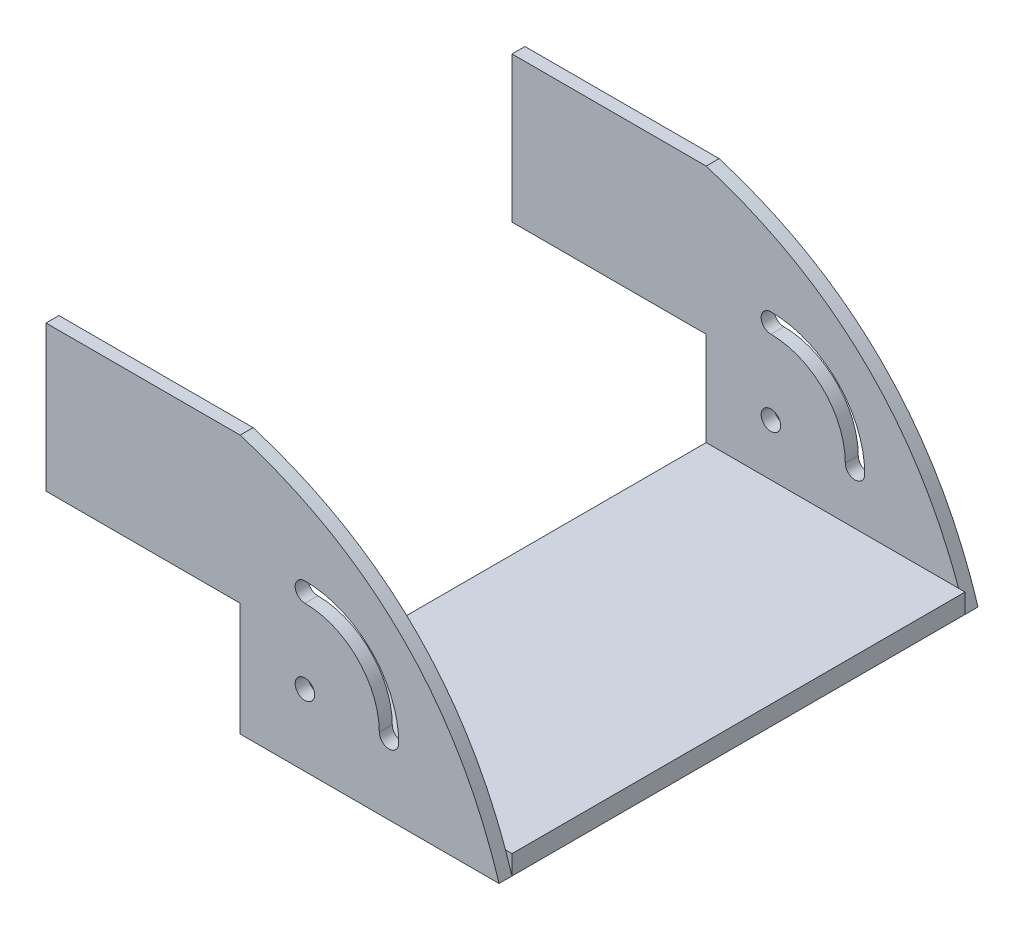
ISO-10303-21;
HEADER;
FILE_DESCRIPTION(('STEP AP214'),'2;1');
FILE_NAME('part.step','',(''),(''),'','','');
FILE_SCHEMA(('AUTOMOTIVE_DESIGN { 1 0 10303 214 1 1 1 1 }'));
ENDSEC;
DATA;
#1=APPLICATION_CONTEXT('core data for automotive mechanical design processes');
#2=APPLICATION_PROTOCOL_DEFINITION('international standard','automotive_design',2000,#1);
#3=PRODUCT_CONTEXT('',#1,'mechanical');
#4=PRODUCT('Part','Part','',(#3));
#5=PRODUCT_RELATED_PRODUCT_CATEGORY('part','',(#4));
#6=PRODUCT_DEFINITION_FORMATION('','',#4);
#7=PRODUCT_DEFINITION_CONTEXT('part definition',#1,'design');
#8=PRODUCT_DEFINITION('design','',#6,#7);
#9=PRODUCT_DEFINITION_SHAPE('','',#8);
#10=(LENGTH_UNIT() NAMED_UNIT(*) SI_UNIT(.MILLI.,.METRE.));
#11=(NAMED_UNIT(*) PLANE_ANGLE_UNIT() SI_UNIT($,.RADIAN.));
#12=(NAMED_UNIT(*) SI_UNIT($,.STERADIAN.) SOLID_ANGLE_UNIT());
#13=UNCERTAINTY_MEASURE_WITH_UNIT(LENGTH_MEASURE(1.E-05),#10,'distance_accuracy_value','');
#14=(GEOMETRIC_REPRESENTATION_CONTEXT(3) GLOBAL_UNCERTAINTY_ASSIGNED_CONTEXT((#13)) GLOBAL_UNIT_ASSIGNED_CONTEXT((#10,
#11,#12)) REPRESENTATION_CONTEXT('',''));
#15=CARTESIAN_POINT('',(0.,0.,0.));
#16=DIRECTION('',(0.,0.,1.));
#17=DIRECTION('',(1.,0.,0.));
#18=AXIS2_PLACEMENT_3D('',#15,#16,#17);
#19=CARTESIAN_POINT('',(0.,0.,0.));
#20=DIRECTION('',(0.,0.,1.));
#21=DIRECTION('',(1.,0.,0.));
#22=AXIS2_PLACEMENT_3D('',#19,#20,#21);
#23=PLANE('',#22);
#24=CARTESIAN_POINT('',(-29.0567596047048,30.7432432432432,0.));
#25=CARTESIAN_POINT('',(1.35924257163405,21.3531150689618,0.));
#26=CARTESIAN_POINT('',(10.9432403952952,-9.25675675675676,0.));
#27=B_SPLINE_CURVE_WITH_KNOTS('',2,(#24,#25,#26),.UNSPECIFIED.,.F.,.F.,(3,3),(0.,1.),.UNSPECIFIED.);
#28=CARTESIAN_POINT('',(9.93561448481804,-6.25675675675675,0.));
#29=VERTEX_POINT('',#28);
#30=CARTESIAN_POINT('',(10.9432403952952,-9.25675675675675,0.));
#31=VERTEX_POINT('',#30);
#32=EDGE_CURVE('E11',#29,#31,#27,.T.);
#33=ORIENTED_EDGE('',*,*,#32,.F.);
#34=DIRECTION('',(-1.,0.,0.));
#35=VECTOR('',#34,1.);
#36=CARTESIAN_POINT('',(10.9432403952952,-6.25675675675675,0.));
#37=LINE('',#36,#35);
#38=CARTESIAN_POINT('',(10.9432403952952,-6.25675675675675,0.));
#39=VERTEX_POINT('',#38);
#40=EDGE_CURVE('E83',#39,#29,#37,.T.);
#41=ORIENTED_EDGE('',*,*,#40,.F.);
#42=DIRECTION('',(0.,1.,0.));
#43=VECTOR('',#42,1.);
#44=CARTESIAN_POINT('',(10.9432403952952,-9.25675675675675,0.));
#45=LINE('',#44,#43);
#46=EDGE_CURVE('E74',#31,#39,#45,.T.);
#47=ORIENTED_EDGE('',*,*,#46,.F.);
#48=EDGE_LOOP('',(#33,#41,#47));
#49=FACE_BOUND('',#48,.T.);
#50=ADVANCED_FACE('F35',(#49),#23,.F.);
#51=CARTESIAN_POINT('',(0.,0.,70.));
#52=DIRECTION('',(0.,0.,1.));
#53=DIRECTION('',(1.,0.,0.));
#54=AXIS2_PLACEMENT_3D('',#51,#52,#53);
#55=PLANE('',#54);
#56=DIRECTION('',(-1.,0.,0.));
#57=VECTOR('',#56,1.);
#58=CARTESIAN_POINT('',(10.9432403952952,-6.25675675675675,70.));
#59=LINE('',#58,#57);
#60=CARTESIAN_POINT('',(10.9432403952952,-6.25675675675675,70.));
#61=VERTEX_POINT('',#60);
#62=CARTESIAN_POINT('',(9.93561448481804,-6.25675676647221,70.));
#63=VERTEX_POINT('',#62);
#64=EDGE_CURVE('E88',#61,#63,#59,.T.);
#65=ORIENTED_EDGE('',*,*,#64,.T.);
#66=CARTESIAN_POINT('',(-29.0567596047048,30.7432432432432,70.));
#67=CARTESIAN_POINT('',(1.35924257163405,21.3531150689618,70.));
#68=CARTESIAN_POINT('',(10.9432403952952,-9.25675675675676,70.));
#69=B_SPLINE_CURVE_WITH_KNOTS('',2,(#66,#67,#68),.UNSPECIFIED.,.F.,.F.,(3,3),(0.,1.),.UNSPECIFIED.);
#70=CARTESIAN_POINT('',(10.9432403952952,-9.25675675675675,70.));
#71=VERTEX_POINT('',#70);
#72=EDGE_CURVE('E45',#63,#71,#69,.T.);
#73=ORIENTED_EDGE('',*,*,#72,.T.);
#74=DIRECTION('',(0.,1.,0.));
#75=VECTOR('',#74,1.);
#76=CARTESIAN_POINT('',(10.9432403952952,-9.25675675675675,70.));
#77=LINE('',#76,#75);
#78=EDGE_CURVE('E61',#71,#61,#77,.T.);
#79=ORIENTED_EDGE('',*,*,#78,.T.);
#80=EDGE_LOOP('',(#65,#73,#79));
#81=FACE_BOUND('',#80,.T.);
#82=ADVANCED_FACE('F363',(#81),#55,.T.);
#83=CARTESIAN_POINT('',(10.9432403952952,-6.25675675675675,70.));
#84=DIRECTION('',(0.,-1.,0.));
#85=DIRECTION('',(1.,0.,0.));
#86=AXIS2_PLACEMENT_3D('',#83,#84,#85);
#87=PLANE('',#86);
#88=ORIENTED_EDGE('',*,*,#40,.T.);
#89=CARTESIAN_POINT('',(-29.0567596047048,-6.25675675675675,0.));
#90=VERTEX_POINT('',#89);
#91=EDGE_CURVE('E39',#29,#90,#37,.T.);
#92=ORIENTED_EDGE('',*,*,#91,.T.);
#93=DIRECTION('',(0.,0.,-1.));
#94=VECTOR('',#93,1.);
#95=CARTESIAN_POINT('',(-29.0567596047048,-6.25675675675675,70.));
#96=LINE('',#95,#94);
#97=CARTESIAN_POINT('',(-29.0567596047048,-6.25675675675675,70.));
#98=VERTEX_POINT('',#97);
#99=EDGE_CURVE('E99',#98,#90,#96,.T.);
#100=ORIENTED_EDGE('',*,*,#99,.F.);
#101=EDGE_CURVE('E82',#63,#98,#59,.T.);
#102=ORIENTED_EDGE('',*,*,#101,.F.);
#103=ORIENTED_EDGE('',*,*,#64,.F.);
#104=DIRECTION('',(0.,0.,-1.));
#105=VECTOR('',#104,1.);
#106=CARTESIAN_POINT('',(10.9432403952952,-6.25675675675675,70.));
#107=LINE('',#106,#105);
#108=EDGE_CURVE('E77',#61,#39,#107,.T.);
#109=ORIENTED_EDGE('',*,*,#108,.T.);
#110=EDGE_LOOP('',(#88,#92,#100,#102,#103,#109));
#111=FACE_BOUND('',#110,.T.);
#112=ADVANCED_FACE('F37',(#111),#87,.F.);
#113=CARTESIAN_POINT('',(-29.0567596047048,-6.25675675675675,70.));
#114=DIRECTION('',(1.,0.,0.));
#115=DIRECTION('',(0.,1.,0.));
#116=AXIS2_PLACEMENT_3D('',#113,#114,#115);
#117=PLANE('',#116);
#118=ORIENTED_EDGE('',*,*,#99,.T.);
#119=DIRECTION('',(0.,-1.,0.));
#120=VECTOR('',#119,1.);
#121=CARTESIAN_POINT('',(-29.0567596047048,0.,0.));
#122=LINE('',#121,#120);
#123=CARTESIAN_POINT('',(-29.0567596047048,8.24324324324324,0.));
#124=VERTEX_POINT('',#123);
#125=EDGE_CURVE('E229',#124,#90,#122,.T.);
#126=ORIENTED_EDGE('',*,*,#125,.F.);
#127=DIRECTION('',(0.,0.,-1.));
#128=VECTOR('',#127,1.);
#129=CARTESIAN_POINT('',(-29.0567596047048,8.24324324324324,0.));
#130=LINE('',#129,#128);
#131=CARTESIAN_POINT('',(-29.0567596047048,8.24324324324324,-1.99999999999999));
#132=VERTEX_POINT('',#131);
#133=EDGE_CURVE('E225',#124,#132,#130,.T.);
#134=ORIENTED_EDGE('',*,*,#133,.T.);
#135=DIRECTION('',(0.,-1.,0.));
#136=VECTOR('',#135,1.);
#137=CARTESIAN_POINT('',(-29.0567596047048,0.,-1.99999999999999));
#138=LINE('',#137,#136);
#139=CARTESIAN_POINT('',(-29.0567596047048,-9.25675675675675,-1.99999999999999));
#140=VERTEX_POINT('',#139);
#141=EDGE_CURVE('E745',#132,#140,#138,.T.);
#142=ORIENTED_EDGE('',*,*,#141,.T.);
#143=DIRECTION('',(0.,0.,-1.));
#144=VECTOR('',#143,1.);
#145=CARTESIAN_POINT('',(-29.0567596047048,-9.25675675675675,70.));
#146=LINE('',#145,#144);
#147=CARTESIAN_POINT('',(-29.0567596047048,-9.25675675675675,72.));
#148=VERTEX_POINT('',#147);
#149=EDGE_CURVE('E96',#148,#140,#146,.T.);
#150=ORIENTED_EDGE('',*,*,#149,.F.);
#151=DIRECTION('',(0.,-1.,0.));
#152=VECTOR('',#151,1.);
#153=CARTESIAN_POINT('',(-29.0567596047048,0.,72.));
#154=LINE('',#153,#152);
#155=CARTESIAN_POINT('',(-29.0567596047048,8.24324324324324,72.));
#156=VERTEX_POINT('',#155);
#157=EDGE_CURVE('E182',#156,#148,#154,.T.);
#158=ORIENTED_EDGE('',*,*,#157,.F.);
#159=DIRECTION('',(0.,0.,-1.));
#160=VECTOR('',#159,1.);
#161=CARTESIAN_POINT('',(-29.0567596047048,8.24324324324324,72.));
#162=LINE('',#161,#160);
#163=CARTESIAN_POINT('',(-29.0567596047048,8.24324324324324,70.));
#164=VERTEX_POINT('',#163);
#165=EDGE_CURVE('E110',#156,#164,#162,.T.);
#166=ORIENTED_EDGE('',*,*,#165,.T.);
#167=DIRECTION('',(0.,-1.,0.));
#168=VECTOR('',#167,1.);
#169=CARTESIAN_POINT('',(-29.0567596047048,0.,70.));
#170=LINE('',#169,#168);
#171=EDGE_CURVE('E104',#164,#98,#170,.T.);
#172=ORIENTED_EDGE('',*,*,#171,.T.);
#173=EDGE_LOOP('',(#118,#126,#134,#142,#150,#158,#166,#172));
#174=FACE_BOUND('',#173,.T.);
#175=ADVANCED_FACE('F177',(#174),#117,.F.);
#176=CARTESIAN_POINT('',(-29.0567596047048,-9.25675675675675,70.));
#177=DIRECTION('',(0.,1.,0.));
#178=DIRECTION('',(0.,0.,1.));
#179=AXIS2_PLACEMENT_3D('',#176,#177,#178);
#180=PLANE('',#179);
#181=ORIENTED_EDGE('',*,*,#149,.T.);
#182=DIRECTION('',(1.,0.,0.));
#183=VECTOR('',#182,1.);
#184=CARTESIAN_POINT('',(0.,-9.25675675675675,-1.99999999999999));
#185=LINE('',#184,#183);
#186=CARTESIAN_POINT('',(10.9432403952952,-9.25675675675675,-1.99999999999999));
#187=VERTEX_POINT('',#186);
#188=EDGE_CURVE('E712',#140,#187,#185,.T.);
#189=ORIENTED_EDGE('',*,*,#188,.T.);
#190=DIRECTION('',(0.,0.,-1.));
#191=VECTOR('',#190,1.);
#192=CARTESIAN_POINT('',(10.9432403952952,-9.25675675675675,0.));
#193=LINE('',#192,#191);
#194=EDGE_CURVE('E222',#31,#187,#193,.T.);
#195=ORIENTED_EDGE('',*,*,#194,.F.);
#196=DIRECTION('',(0.,0.,-1.));
#197=VECTOR('',#196,1.);
#198=CARTESIAN_POINT('',(10.9432403952952,-9.25675675675675,70.));
#199=LINE('',#198,#197);
#200=EDGE_CURVE('E81',#71,#31,#199,.T.);
#201=ORIENTED_EDGE('',*,*,#200,.F.);
#202=DIRECTION('',(0.,0.,-1.));
#203=VECTOR('',#202,1.);
#204=CARTESIAN_POINT('',(10.9432403952952,-9.25675675675675,72.));
#205=LINE('',#204,#203);
#206=CARTESIAN_POINT('',(10.9432403952952,-9.25675675675675,72.));
#207=VERTEX_POINT('',#206);
#208=EDGE_CURVE('E165',#207,#71,#205,.T.);
#209=ORIENTED_EDGE('',*,*,#208,.F.);
#210=DIRECTION('',(1.,0.,0.));
#211=VECTOR('',#210,1.);
#212=CARTESIAN_POINT('',(0.,-9.25675675675675,72.));
#213=LINE('',#212,#211);
#214=EDGE_CURVE('E308',#148,#207,#213,.T.);
#215=ORIENTED_EDGE('',*,*,#214,.F.);
#216=EDGE_LOOP('',(#181,#189,#195,#201,#209,#215));
#217=FACE_BOUND('',#216,.T.);
#218=ADVANCED_FACE('F373',(#217),#180,.F.);
#219=CARTESIAN_POINT('',(10.9432403952952,-9.25675675675675,70.));
#220=DIRECTION('',(-1.,0.,0.));
#221=DIRECTION('',(0.,0.,1.));
#222=AXIS2_PLACEMENT_3D('',#219,#220,#221);
#223=PLANE('',#222);
#224=ORIENTED_EDGE('',*,*,#46,.T.);
#225=ORIENTED_EDGE('',*,*,#108,.F.);
#226=ORIENTED_EDGE('',*,*,#78,.F.);
#227=ORIENTED_EDGE('',*,*,#200,.T.);
#228=EDGE_LOOP('',(#224,#225,#226,#227));
#229=FACE_BOUND('',#228,.T.);
#230=ADVANCED_FACE('F76',(#229),#223,.F.);
#231=CARTESIAN_POINT('',(0.,0.,70.));
#232=DIRECTION('',(0.,0.,1.));
#233=DIRECTION('',(1.,0.,0.));
#234=AXIS2_PLACEMENT_3D('',#231,#232,#233);
#235=PLANE('',#234);
#236=CARTESIAN_POINT('',(-19.0567596047048,1.74324324324325,70.));
#237=DIRECTION('',(0.,0.,1.));
#238=DIRECTION('',(1.,0.,0.));
#239=AXIS2_PLACEMENT_3D('',#236,#237,#238);
#240=CIRCLE('',#239,1.5);
#241=CARTESIAN_POINT('',(-17.5567596047048,1.74324324324325,70.));
#242=VERTEX_POINT('',#241);
#243=EDGE_CURVE('E129',#242,#242,#240,.T.);
#244=ORIENTED_EDGE('',*,*,#243,.T.);
#245=EDGE_LOOP('',(#244));
#246=FACE_BOUND('',#245,.T.);
#247=CARTESIAN_POINT('',(-19.0567596047048,14.7432432432432,70.));
#248=DIRECTION('',(0.,0.,1.));
#249=DIRECTION('',(1.,0.,0.));
#250=AXIS2_PLACEMENT_3D('',#247,#248,#249);
#251=CIRCLE('',#250,1.5);
#252=CARTESIAN_POINT('',(-19.0567596047048,16.2432432432432,70.));
#253=VERTEX_POINT('',#252);
#254=CARTESIAN_POINT('',(-19.0567596047048,13.2432432432432,70.));
#255=VERTEX_POINT('',#254);
#256=EDGE_CURVE('E132',#253,#255,#251,.T.);
#257=ORIENTED_EDGE('',*,*,#256,.T.);
#258=CARTESIAN_POINT('',(-19.0567596047048,1.74324324324325,70.));
#259=DIRECTION('',(0.,0.,1.));
#260=DIRECTION('',(1.,0.,0.));
#261=AXIS2_PLACEMENT_3D('',#258,#259,#260);
#262=CIRCLE('',#261,11.5);
#263=CARTESIAN_POINT('',(-7.55675960470479,1.74324324324325,70.));
#264=VERTEX_POINT('',#263);
#265=EDGE_CURVE('E141',#264,#255,#262,.T.);
#266=ORIENTED_EDGE('',*,*,#265,.F.);
#267=CARTESIAN_POINT('',(-6.05675960470479,1.74324324324325,70.));
#268=DIRECTION('',(0.,0.,1.));
#269=DIRECTION('',(1.,0.,0.));
#270=AXIS2_PLACEMENT_3D('',#267,#268,#269);
#271=CIRCLE('',#270,1.5);
#272=CARTESIAN_POINT('',(-4.55675960470479,1.74324324324325,70.));
#273=VERTEX_POINT('',#272);
#274=EDGE_CURVE('E138',#264,#273,#271,.T.);
#275=ORIENTED_EDGE('',*,*,#274,.T.);
#276=CARTESIAN_POINT('',(-19.0567596047048,1.74324324324325,70.));
#277=DIRECTION('',(0.,0.,1.));
#278=DIRECTION('',(1.,0.,0.));
#279=AXIS2_PLACEMENT_3D('',#276,#277,#278);
#280=CIRCLE('',#279,14.5);
#281=EDGE_CURVE('E135',#273,#253,#280,.T.);
#282=ORIENTED_EDGE('',*,*,#281,.T.);
#283=EDGE_LOOP('',(#257,#266,#275,#282));
#284=FACE_BOUND('',#283,.T.);
#285=CARTESIAN_POINT('',(-29.0567596047048,30.7432432432432,70.));
#286=VERTEX_POINT('',#285);
#287=EDGE_CURVE('E108',#286,#63,#69,.T.);
#288=ORIENTED_EDGE('',*,*,#287,.T.);
#289=ORIENTED_EDGE('',*,*,#101,.T.);
#290=ORIENTED_EDGE('',*,*,#171,.F.);
#291=DIRECTION('',(-1.,0.,0.));
#292=VECTOR('',#291,1.);
#293=CARTESIAN_POINT('',(0.,8.24324324324325,70.));
#294=LINE('',#293,#292);
#295=CARTESIAN_POINT('',(-59.0567596047048,8.24324324324324,70.));
#296=VERTEX_POINT('',#295);
#297=EDGE_CURVE('E109',#164,#296,#294,.T.);
#298=ORIENTED_EDGE('',*,*,#297,.T.);
#299=DIRECTION('',(0.,-1.,0.));
#300=VECTOR('',#299,1.);
#301=CARTESIAN_POINT('',(-59.0567596047048,0.,70.));
#302=LINE('',#301,#300);
#303=CARTESIAN_POINT('',(-59.0567596047048,30.7432432432432,70.));
#304=VERTEX_POINT('',#303);
#305=EDGE_CURVE('E126',#304,#296,#302,.T.);
#306=ORIENTED_EDGE('',*,*,#305,.F.);
#307=DIRECTION('',(-1.,0.,0.));
#308=VECTOR('',#307,1.);
#309=CARTESIAN_POINT('',(0.,30.7432432432433,70.));
#310=LINE('',#309,#308);
#311=EDGE_CURVE('E120',#286,#304,#310,.T.);
#312=ORIENTED_EDGE('',*,*,#311,.F.);
#313=EDGE_LOOP('',(#288,#289,#290,#298,#306,#312));
#314=FACE_BOUND('',#313,.T.);
#315=ADVANCED_FACE('F192',(#246,#284,#314),#235,.F.);
#316=CARTESIAN_POINT('',(-19.0567596047048,14.7432432432432,72.));
#317=DIRECTION('',(0.,0.,-1.));
#318=DIRECTION('',(-1.,0.,0.));
#319=AXIS2_PLACEMENT_3D('',#316,#317,#318);
#320=CYLINDRICAL_SURFACE('',#319,1.5);
#321=ORIENTED_EDGE('',*,*,#256,.F.);
#322=DIRECTION('',(0.,0.,-1.));
#323=VECTOR('',#322,1.);
#324=CARTESIAN_POINT('',(-19.0567596047048,16.2432432432432,72.));
#325=LINE('',#324,#323);
#326=CARTESIAN_POINT('',(-19.0567596047048,16.2432432432432,72.));
#327=VERTEX_POINT('',#326);
#328=EDGE_CURVE('E90',#327,#253,#325,.T.);
#329=ORIENTED_EDGE('',*,*,#328,.F.);
#330=CARTESIAN_POINT('',(-19.0567596047048,14.7432432432432,72.));
#331=DIRECTION('',(0.,0.,1.));
#332=DIRECTION('',(1.,0.,0.));
#333=AXIS2_PLACEMENT_3D('',#330,#331,#332);
#334=CIRCLE('',#333,1.5);
#335=CARTESIAN_POINT('',(-19.0567596047048,13.2432432432432,72.));
#336=VERTEX_POINT('',#335);
#337=EDGE_CURVE('E320',#327,#336,#334,.T.);
#338=ORIENTED_EDGE('',*,*,#337,.T.);
#339=DIRECTION('',(0.,0.,-1.));
#340=VECTOR('',#339,1.);
#341=CARTESIAN_POINT('',(-19.0567596047048,13.2432432432432,72.));
#342=LINE('',#341,#340);
#343=EDGE_CURVE('E145',#336,#255,#342,.T.);
#344=ORIENTED_EDGE('',*,*,#343,.T.);
#345=EDGE_LOOP('',(#321,#329,#338,#344));
#346=FACE_BOUND('',#345,.T.);
#347=ADVANCED_FACE('F268',(#346),#320,.F.);
#348=CARTESIAN_POINT('',(-19.0567596047048,1.74324324324325,72.));
#349=DIRECTION('',(0.,0.,-1.));
#350=DIRECTION('',(-1.,0.,0.));
#351=AXIS2_PLACEMENT_3D('',#348,#349,#350);
#352=CYLINDRICAL_SURFACE('',#351,14.5);
#353=ORIENTED_EDGE('',*,*,#281,.F.);
#354=DIRECTION('',(0.,0.,-1.));
#355=VECTOR('',#354,1.);
#356=CARTESIAN_POINT('',(-4.55675960470479,1.74324324324325,72.));
#357=LINE('',#356,#355);
#358=CARTESIAN_POINT('',(-4.55675960470479,1.74324324324325,72.));
#359=VERTEX_POINT('',#358);
#360=EDGE_CURVE('E151',#359,#273,#357,.T.);
#361=ORIENTED_EDGE('',*,*,#360,.F.);
#362=CARTESIAN_POINT('',(-19.0567596047048,1.74324324324325,72.));
#363=DIRECTION('',(0.,0.,1.));
#364=DIRECTION('',(1.,0.,0.));
#365=AXIS2_PLACEMENT_3D('',#362,#363,#364);
#366=CIRCLE('',#365,14.5);
#367=EDGE_CURVE('E323',#359,#327,#366,.T.);
#368=ORIENTED_EDGE('',*,*,#367,.T.);
#369=ORIENTED_EDGE('',*,*,#328,.T.);
#370=EDGE_LOOP('',(#353,#361,#368,#369));
#371=FACE_BOUND('',#370,.T.);
#372=ADVANCED_FACE('F277',(#371),#352,.F.);
#373=CARTESIAN_POINT('',(-6.05675960470479,1.74324324324325,72.));
#374=DIRECTION('',(0.,0.,-1.));
#375=DIRECTION('',(-1.,0.,0.));
#376=AXIS2_PLACEMENT_3D('',#373,#374,#375);
#377=CYLINDRICAL_SURFACE('',#376,1.5);
#378=ORIENTED_EDGE('',*,*,#274,.F.);
#379=DIRECTION('',(0.,0.,-1.));
#380=VECTOR('',#379,1.);
#381=CARTESIAN_POINT('',(-7.55675960470479,1.74324324324325,72.));
#382=LINE('',#381,#380);
#383=CARTESIAN_POINT('',(-7.55675960470479,1.74324324324325,72.));
#384=VERTEX_POINT('',#383);
#385=EDGE_CURVE('E148',#384,#264,#382,.T.);
#386=ORIENTED_EDGE('',*,*,#385,.F.);
#387=CARTESIAN_POINT('',(-6.05675960470479,1.74324324324325,72.));
#388=DIRECTION('',(0.,0.,1.));
#389=DIRECTION('',(1.,0.,0.));
#390=AXIS2_PLACEMENT_3D('',#387,#388,#389);
#391=CIRCLE('',#390,1.5);
#392=EDGE_CURVE('E326',#384,#359,#391,.T.);
#393=ORIENTED_EDGE('',*,*,#392,.T.);
#394=ORIENTED_EDGE('',*,*,#360,.T.);
#395=EDGE_LOOP('',(#378,#386,#393,#394));
#396=FACE_BOUND('',#395,.T.);
#397=ADVANCED_FACE('F274',(#396),#377,.F.);
#398=CARTESIAN_POINT('',(0.,8.24324324324325,72.));
#399=DIRECTION('',(0.,-1.,0.));
#400=DIRECTION('',(1.,0.,0.));
#401=AXIS2_PLACEMENT_3D('',#398,#399,#400);
#402=PLANE('',#401);
#403=ORIENTED_EDGE('',*,*,#297,.F.);
#404=ORIENTED_EDGE('',*,*,#165,.F.);
#405=DIRECTION('',(-1.,0.,0.));
#406=VECTOR('',#405,1.);
#407=CARTESIAN_POINT('',(0.,8.24324324324325,72.));
#408=LINE('',#407,#406);
#409=CARTESIAN_POINT('',(-59.0567596047048,8.24324324324324,72.));
#410=VERTEX_POINT('',#409);
#411=EDGE_CURVE('E144',#156,#410,#408,.T.);
#412=ORIENTED_EDGE('',*,*,#411,.T.);
#413=DIRECTION('',(0.,0.,-1.));
#414=VECTOR('',#413,1.);
#415=CARTESIAN_POINT('',(-59.0567596047048,8.24324324324324,72.));
#416=LINE('',#415,#414);
#417=EDGE_CURVE('E156',#410,#296,#416,.T.);
#418=ORIENTED_EDGE('',*,*,#417,.T.);
#419=EDGE_LOOP('',(#403,#404,#412,#418));
#420=FACE_BOUND('',#419,.T.);
#421=ADVANCED_FACE('F195',(#420),#402,.T.);
#422=CARTESIAN_POINT('',(-29.0567596047048,30.7432432432432,72.));
#423=CARTESIAN_POINT('',(1.35924257163405,21.3531150689618,72.));
#424=CARTESIAN_POINT('',(10.9432403952952,-9.25675675675676,72.));
#425=B_SPLINE_CURVE_WITH_KNOTS('',2,(#422,#423,#424),.UNSPECIFIED.,.F.,.F.,(3,3),(0.,1.),.UNSPECIFIED.);
#426=DIRECTION('',(0.,0.,-1.));
#427=VECTOR('',#426,1.);
#428=SURFACE_OF_LINEAR_EXTRUSION('',#425,#427);
#429=ORIENTED_EDGE('',*,*,#287,.F.);
#430=DIRECTION('',(0.,0.,-1.));
#431=VECTOR('',#430,1.);
#432=CARTESIAN_POINT('',(-29.0567596047048,30.7432432432432,72.));
#433=LINE('',#432,#431);
#434=CARTESIAN_POINT('',(-29.0567596047048,30.7432432432432,72.));
#435=VERTEX_POINT('',#434);
#436=EDGE_CURVE('E163',#435,#286,#433,.T.);
#437=ORIENTED_EDGE('',*,*,#436,.F.);
#438=EDGE_CURVE('E301',#435,#207,#425,.T.);
#439=ORIENTED_EDGE('',*,*,#438,.T.);
#440=ORIENTED_EDGE('',*,*,#208,.T.);
#441=ORIENTED_EDGE('',*,*,#72,.F.);
#442=EDGE_LOOP('',(#429,#437,#439,#440,#441));
#443=FACE_BOUND('',#442,.T.);
#444=ADVANCED_FACE('F295',(#443),#428,.T.);
#445=CARTESIAN_POINT('',(0.,30.7432432432433,72.));
#446=DIRECTION('',(0.,-1.,0.));
#447=DIRECTION('',(1.,0.,0.));
#448=AXIS2_PLACEMENT_3D('',#445,#446,#447);
#449=PLANE('',#448);
#450=ORIENTED_EDGE('',*,*,#311,.T.);
#451=DIRECTION('',(0.,0.,-1.));
#452=VECTOR('',#451,1.);
#453=CARTESIAN_POINT('',(-59.0567596047048,30.7432432432432,72.));
#454=LINE('',#453,#452);
#455=CARTESIAN_POINT('',(-59.0567596047048,30.7432432432432,72.));
#456=VERTEX_POINT('',#455);
#457=EDGE_CURVE('E159',#456,#304,#454,.T.);
#458=ORIENTED_EDGE('',*,*,#457,.F.);
#459=DIRECTION('',(-1.,0.,0.));
#460=VECTOR('',#459,1.);
#461=CARTESIAN_POINT('',(0.,30.7432432432433,72.));
#462=LINE('',#461,#460);
#463=EDGE_CURVE('E307',#435,#456,#462,.T.);
#464=ORIENTED_EDGE('',*,*,#463,.F.);
#465=ORIENTED_EDGE('',*,*,#436,.T.);
#466=EDGE_LOOP('',(#450,#458,#464,#465));
#467=FACE_BOUND('',#466,.T.);
#468=ADVANCED_FACE('F288',(#467),#449,.F.);
#469=CARTESIAN_POINT('',(-19.0567596047048,1.74324324324325,72.));
#470=DIRECTION('',(0.,0.,-1.));
#471=DIRECTION('',(-1.,0.,0.));
#472=AXIS2_PLACEMENT_3D('',#469,#470,#471);
#473=CYLINDRICAL_SURFACE('',#472,1.5);
#474=CARTESIAN_POINT('',(-19.0567596047048,1.74324324324325,72.));
#475=DIRECTION('',(0.,0.,1.));
#476=DIRECTION('',(1.,0.,0.));
#477=AXIS2_PLACEMENT_3D('',#474,#475,#476);
#478=CIRCLE('',#477,1.5);
#479=CARTESIAN_POINT('',(-17.5567596047048,1.74324324324325,72.));
#480=VERTEX_POINT('',#479);
#481=EDGE_CURVE('E317',#480,#480,#478,.T.);
#482=ORIENTED_EDGE('',*,*,#481,.T.);
#483=EDGE_LOOP('',(#482));
#484=FACE_BOUND('',#483,.T.);
#485=ORIENTED_EDGE('',*,*,#243,.F.);
#486=EDGE_LOOP('',(#485));
#487=FACE_BOUND('',#486,.T.);
#488=ADVANCED_FACE('F285',(#484,#487),#473,.F.);
#489=CARTESIAN_POINT('',(-59.0567596047048,0.,72.));
#490=DIRECTION('',(1.,0.,0.));
#491=DIRECTION('',(0.,1.,0.));
#492=AXIS2_PLACEMENT_3D('',#489,#490,#491);
#493=PLANE('',#492);
#494=ORIENTED_EDGE('',*,*,#305,.T.);
#495=ORIENTED_EDGE('',*,*,#417,.F.);
#496=DIRECTION('',(0.,-1.,0.));
#497=VECTOR('',#496,1.);
#498=CARTESIAN_POINT('',(-59.0567596047048,0.,72.));
#499=LINE('',#498,#497);
#500=EDGE_CURVE('E314',#456,#410,#499,.T.);
#501=ORIENTED_EDGE('',*,*,#500,.F.);
#502=ORIENTED_EDGE('',*,*,#457,.T.);
#503=EDGE_LOOP('',(#494,#495,#501,#502));
#504=FACE_BOUND('',#503,.T.);
#505=ADVANCED_FACE('F272',(#504),#493,.F.);
#506=CARTESIAN_POINT('',(-19.0567596047048,1.74324324324325,72.));
#507=DIRECTION('',(0.,0.,-1.));
#508=DIRECTION('',(-1.,0.,0.));
#509=AXIS2_PLACEMENT_3D('',#506,#507,#508);
#510=CYLINDRICAL_SURFACE('',#509,11.5);
#511=ORIENTED_EDGE('',*,*,#265,.T.);
#512=ORIENTED_EDGE('',*,*,#343,.F.);
#513=CARTESIAN_POINT('',(-19.0567596047048,1.74324324324325,72.));
#514=DIRECTION('',(0.,0.,1.));
#515=DIRECTION('',(1.,0.,0.));
#516=AXIS2_PLACEMENT_3D('',#513,#514,#515);
#517=CIRCLE('',#516,11.5);
#518=EDGE_CURVE('E160',#384,#336,#517,.T.);
#519=ORIENTED_EDGE('',*,*,#518,.F.);
#520=ORIENTED_EDGE('',*,*,#385,.T.);
#521=EDGE_LOOP('',(#511,#512,#519,#520));
#522=FACE_BOUND('',#521,.T.);
#523=ADVANCED_FACE('F264',(#522),#510,.T.);
#524=CARTESIAN_POINT('',(0.,0.,72.));
#525=DIRECTION('',(0.,0.,1.));
#526=DIRECTION('',(1.,0.,0.));
#527=AXIS2_PLACEMENT_3D('',#524,#525,#526);
#528=PLANE('',#527);
#529=ORIENTED_EDGE('',*,*,#411,.F.);
#530=ORIENTED_EDGE('',*,*,#157,.T.);
#531=ORIENTED_EDGE('',*,*,#214,.T.);
#532=ORIENTED_EDGE('',*,*,#438,.F.);
#533=ORIENTED_EDGE('',*,*,#463,.T.);
#534=ORIENTED_EDGE('',*,*,#500,.T.);
#535=EDGE_LOOP('',(#529,#530,#531,#532,#533,#534));
#536=FACE_BOUND('',#535,.T.);
#537=ORIENTED_EDGE('',*,*,#481,.F.);
#538=EDGE_LOOP('',(#537));
#539=FACE_BOUND('',#538,.T.);
#540=ORIENTED_EDGE('',*,*,#337,.F.);
#541=ORIENTED_EDGE('',*,*,#367,.F.);
#542=ORIENTED_EDGE('',*,*,#392,.F.);
#543=ORIENTED_EDGE('',*,*,#518,.T.);
#544=EDGE_LOOP('',(#540,#541,#542,#543));
#545=FACE_BOUND('',#544,.T.);
#546=ADVANCED_FACE('F260',(#536,#539,#545),#528,.T.);
#547=CARTESIAN_POINT('',(0.,0.,0.));
#548=DIRECTION('',(0.,0.,1.));
#549=DIRECTION('',(1.,0.,0.));
#550=AXIS2_PLACEMENT_3D('',#547,#548,#549);
#551=PLANE('',#550);
#552=CARTESIAN_POINT('',(-19.0567596047048,14.7432432432432,0.));
#553=DIRECTION('',(0.,0.,1.));
#554=DIRECTION('',(1.,0.,0.));
#555=AXIS2_PLACEMENT_3D('',#552,#553,#554);
#556=CIRCLE('',#555,1.5);
#557=CARTESIAN_POINT('',(-19.0567596047048,16.2432432432432,0.));
#558=VERTEX_POINT('',#557);
#559=CARTESIAN_POINT('',(-19.0567596047048,13.2432432432432,0.));
#560=VERTEX_POINT('',#559);
#561=EDGE_CURVE('E733',#558,#560,#556,.T.);
#562=ORIENTED_EDGE('',*,*,#561,.F.);
#563=CARTESIAN_POINT('',(-19.0567596047048,1.74324324324325,0.));
#564=DIRECTION('',(0.,0.,1.));
#565=DIRECTION('',(1.,0.,0.));
#566=AXIS2_PLACEMENT_3D('',#563,#564,#565);
#567=CIRCLE('',#566,14.5);
#568=CARTESIAN_POINT('',(-4.55675960470479,1.74324324324325,0.));
#569=VERTEX_POINT('',#568);
#570=EDGE_CURVE('E736',#569,#558,#567,.T.);
#571=ORIENTED_EDGE('',*,*,#570,.F.);
#572=CARTESIAN_POINT('',(-6.05675960470479,1.74324324324325,0.));
#573=DIRECTION('',(0.,0.,1.));
#574=DIRECTION('',(1.,0.,0.));
#575=AXIS2_PLACEMENT_3D('',#572,#573,#574);
#576=CIRCLE('',#575,1.5);
#577=CARTESIAN_POINT('',(-7.55675960470479,1.74324324324325,0.));
#578=VERTEX_POINT('',#577);
#579=EDGE_CURVE('E667',#578,#569,#576,.T.);
#580=ORIENTED_EDGE('',*,*,#579,.F.);
#581=CARTESIAN_POINT('',(-19.0567596047048,1.74324324324325,0.));
#582=DIRECTION('',(0.,0.,1.));
#583=DIRECTION('',(1.,0.,0.));
#584=AXIS2_PLACEMENT_3D('',#581,#582,#583);
#585=CIRCLE('',#584,11.5);
#586=EDGE_CURVE('E216',#578,#560,#585,.T.);
#587=ORIENTED_EDGE('',*,*,#586,.T.);
#588=EDGE_LOOP('',(#562,#571,#580,#587));
#589=FACE_BOUND('',#588,.T.);
#590=CARTESIAN_POINT('',(-19.0567596047048,1.74324324324325,0.));
#591=DIRECTION('',(0.,0.,1.));
#592=DIRECTION('',(1.,0.,0.));
#593=AXIS2_PLACEMENT_3D('',#590,#591,#592);
#594=CIRCLE('',#593,1.5);
#595=CARTESIAN_POINT('',(-17.5567596047048,1.74324324324325,0.));
#596=VERTEX_POINT('',#595);
#597=EDGE_CURVE('E737',#596,#596,#594,.T.);
#598=ORIENTED_EDGE('',*,*,#597,.F.);
#599=EDGE_LOOP('',(#598));
#600=FACE_BOUND('',#599,.T.);
#601=ORIENTED_EDGE('',*,*,#91,.F.);
#602=CARTESIAN_POINT('',(-29.0567596047048,30.7432432432432,0.));
#603=VERTEX_POINT('',#602);
#604=EDGE_CURVE('E47',#603,#29,#27,.T.);
#605=ORIENTED_EDGE('',*,*,#604,.F.);
#606=DIRECTION('',(-1.,0.,0.));
#607=VECTOR('',#606,1.);
#608=CARTESIAN_POINT('',(0.,30.7432432432433,0.));
#609=LINE('',#608,#607);
#610=CARTESIAN_POINT('',(-59.0567596047048,30.7432432432432,0.));
#611=VERTEX_POINT('',#610);
#612=EDGE_CURVE('E242',#603,#611,#609,.T.);
#613=ORIENTED_EDGE('',*,*,#612,.T.);
#614=DIRECTION('',(0.,-1.,0.));
#615=VECTOR('',#614,1.);
#616=CARTESIAN_POINT('',(-59.0567596047048,0.,0.));
#617=LINE('',#616,#615);
#618=CARTESIAN_POINT('',(-59.0567596047048,8.24324324324324,0.));
#619=VERTEX_POINT('',#618);
#620=EDGE_CURVE('E761',#611,#619,#617,.T.);
#621=ORIENTED_EDGE('',*,*,#620,.T.);
#622=DIRECTION('',(-1.,0.,0.));
#623=VECTOR('',#622,1.);
#624=CARTESIAN_POINT('',(0.,8.24324324324325,0.));
#625=LINE('',#624,#623);
#626=EDGE_CURVE('E233',#124,#619,#625,.T.);
#627=ORIENTED_EDGE('',*,*,#626,.F.);
#628=ORIENTED_EDGE('',*,*,#125,.T.);
#629=EDGE_LOOP('',(#601,#605,#613,#621,#627,#628));
#630=FACE_BOUND('',#629,.T.);
#631=ADVANCED_FACE('F263',(#589,#600,#630),#551,.T.);
#632=CARTESIAN_POINT('',(-19.0567596047048,14.7432432432432,0.));
#633=DIRECTION('',(0.,0.,-1.));
#634=DIRECTION('',(-1.,0.,0.));
#635=AXIS2_PLACEMENT_3D('',#632,#633,#634);
#636=CYLINDRICAL_SURFACE('',#635,1.5);
#637=CARTESIAN_POINT('',(-19.0567596047048,14.7432432432432,-1.99999999999999));
#638=DIRECTION('',(0.,0.,1.));
#639=DIRECTION('',(1.,0.,0.));
#640=AXIS2_PLACEMENT_3D('',#637,#638,#639);
#641=CIRCLE('',#640,1.5);
#642=CARTESIAN_POINT('',(-19.0567596047048,16.2432432432432,-1.99999999999999));
#643=VERTEX_POINT('',#642);
#644=CARTESIAN_POINT('',(-19.0567596047048,13.2432432432432,-1.99999999999999));
#645=VERTEX_POINT('',#644);
#646=EDGE_CURVE('E637',#643,#645,#641,.T.);
#647=ORIENTED_EDGE('',*,*,#646,.F.);
#648=DIRECTION('',(0.,0.,-1.));
#649=VECTOR('',#648,1.);
#650=CARTESIAN_POINT('',(-19.0567596047048,16.2432432432432,0.));
#651=LINE('',#650,#649);
#652=EDGE_CURVE('E197',#558,#643,#651,.T.);
#653=ORIENTED_EDGE('',*,*,#652,.F.);
#654=ORIENTED_EDGE('',*,*,#561,.T.);
#655=DIRECTION('',(0.,0.,-1.));
#656=VECTOR('',#655,1.);
#657=CARTESIAN_POINT('',(-19.0567596047048,13.2432432432432,0.));
#658=LINE('',#657,#656);
#659=EDGE_CURVE('E228',#560,#645,#658,.T.);
#660=ORIENTED_EDGE('',*,*,#659,.T.);
#661=EDGE_LOOP('',(#647,#653,#654,#660));
#662=FACE_BOUND('',#661,.T.);
#663=ADVANCED_FACE('F441',(#662),#636,.F.);
#664=CARTESIAN_POINT('',(-19.0567596047048,1.74324324324325,0.));
#665=DIRECTION('',(0.,0.,-1.));
#666=DIRECTION('',(-1.,0.,0.));
#667=AXIS2_PLACEMENT_3D('',#664,#665,#666);
#668=CYLINDRICAL_SURFACE('',#667,14.5);
#669=CARTESIAN_POINT('',(-19.0567596047048,1.74324324324325,-1.99999999999999));
#670=DIRECTION('',(0.,0.,1.));
#671=DIRECTION('',(1.,0.,0.));
#672=AXIS2_PLACEMENT_3D('',#669,#670,#671);
#673=CIRCLE('',#672,14.5);
#674=CARTESIAN_POINT('',(-4.55675960470479,1.74324324324325,-1.99999999999999));
#675=VERTEX_POINT('',#674);
#676=EDGE_CURVE('E643',#675,#643,#673,.T.);
#677=ORIENTED_EDGE('',*,*,#676,.F.);
#678=DIRECTION('',(0.,0.,-1.));
#679=VECTOR('',#678,1.);
#680=CARTESIAN_POINT('',(-4.55675960470479,1.74324324324325,0.));
#681=LINE('',#680,#679);
#682=EDGE_CURVE('E199',#569,#675,#681,.T.);
#683=ORIENTED_EDGE('',*,*,#682,.F.);
#684=ORIENTED_EDGE('',*,*,#570,.T.);
#685=ORIENTED_EDGE('',*,*,#652,.T.);
#686=EDGE_LOOP('',(#677,#683,#684,#685));
#687=FACE_BOUND('',#686,.T.);
#688=ADVANCED_FACE('F449',(#687),#668,.F.);
#689=CARTESIAN_POINT('',(-6.05675960470479,1.74324324324325,0.));
#690=DIRECTION('',(0.,0.,-1.));
#691=DIRECTION('',(-1.,0.,0.));
#692=AXIS2_PLACEMENT_3D('',#689,#690,#691);
#693=CYLINDRICAL_SURFACE('',#692,1.5);
#694=CARTESIAN_POINT('',(-6.05675960470479,1.74324324324325,-1.99999999999999));
#695=DIRECTION('',(0.,0.,1.));
#696=DIRECTION('',(1.,0.,0.));
#697=AXIS2_PLACEMENT_3D('',#694,#695,#696);
#698=CIRCLE('',#697,1.5);
#699=CARTESIAN_POINT('',(-7.55675960470479,1.74324324324325,-1.99999999999999));
#700=VERTEX_POINT('',#699);
#701=EDGE_CURVE('E648',#700,#675,#698,.T.);
#702=ORIENTED_EDGE('',*,*,#701,.F.);
#703=DIRECTION('',(0.,0.,-1.));
#704=VECTOR('',#703,1.);
#705=CARTESIAN_POINT('',(-7.55675960470479,1.74324324324325,0.));
#706=LINE('',#705,#704);
#707=EDGE_CURVE('E208',#578,#700,#706,.T.);
#708=ORIENTED_EDGE('',*,*,#707,.F.);
#709=ORIENTED_EDGE('',*,*,#579,.T.);
#710=ORIENTED_EDGE('',*,*,#682,.T.);
#711=EDGE_LOOP('',(#702,#708,#709,#710));
#712=FACE_BOUND('',#711,.T.);
#713=ADVANCED_FACE('F258',(#712),#693,.F.);
#714=CARTESIAN_POINT('',(0.,8.24324324324325,0.));
#715=DIRECTION('',(0.,-1.,0.));
#716=DIRECTION('',(1.,0.,0.));
#717=AXIS2_PLACEMENT_3D('',#714,#715,#716);
#718=PLANE('',#717);
#719=DIRECTION('',(-1.,0.,0.));
#720=VECTOR('',#719,1.);
#721=CARTESIAN_POINT('',(0.,8.24324324324325,-1.99999999999999));
#722=LINE('',#721,#720);
#723=CARTESIAN_POINT('',(-59.0567596047048,8.24324324324324,-1.99999999999999));
#724=VERTEX_POINT('',#723);
#725=EDGE_CURVE('E628',#132,#724,#722,.T.);
#726=ORIENTED_EDGE('',*,*,#725,.F.);
#727=ORIENTED_EDGE('',*,*,#133,.F.);
#728=ORIENTED_EDGE('',*,*,#626,.T.);
#729=DIRECTION('',(0.,0.,-1.));
#730=VECTOR('',#729,1.);
#731=CARTESIAN_POINT('',(-59.0567596047048,8.24324324324324,0.));
#732=LINE('',#731,#730);
#733=EDGE_CURVE('E212',#619,#724,#732,.T.);
#734=ORIENTED_EDGE('',*,*,#733,.T.);
#735=EDGE_LOOP('',(#726,#727,#728,#734));
#736=FACE_BOUND('',#735,.T.);
#737=ADVANCED_FACE('F253',(#736),#718,.T.);
#738=DIRECTION('',(0.,0.,-1.));
#739=VECTOR('',#738,1.);
#740=SURFACE_OF_LINEAR_EXTRUSION('',#27,#739);
#741=CARTESIAN_POINT('',(-29.0567596047048,30.7432432432432,-1.99999999999999));
#742=CARTESIAN_POINT('',(1.35924257163405,21.3531150689618,-1.99999999999999));
#743=CARTESIAN_POINT('',(10.9432403952952,-9.25675675675676,-1.99999999999999));
#744=B_SPLINE_CURVE_WITH_KNOTS('',2,(#741,#742,#743),.UNSPECIFIED.,.F.,.F.,(3,3),(0.,1.),.UNSPECIFIED.);
#745=CARTESIAN_POINT('',(-29.0567596047048,30.7432432432432,-1.99999999999999));
#746=VERTEX_POINT('',#745);
#747=EDGE_CURVE('E718',#746,#187,#744,.T.);
#748=ORIENTED_EDGE('',*,*,#747,.F.);
#749=DIRECTION('',(0.,0.,-1.));
#750=VECTOR('',#749,1.);
#751=CARTESIAN_POINT('',(-29.0567596047048,30.7432432432432,0.));
#752=LINE('',#751,#750);
#753=EDGE_CURVE('E219',#603,#746,#752,.T.);
#754=ORIENTED_EDGE('',*,*,#753,.F.);
#755=ORIENTED_EDGE('',*,*,#604,.T.);
#756=ORIENTED_EDGE('',*,*,#32,.T.);
#757=ORIENTED_EDGE('',*,*,#194,.T.);
#758=EDGE_LOOP('',(#748,#754,#755,#756,#757));
#759=FACE_BOUND('',#758,.T.);
#760=ADVANCED_FACE('F248',(#759),#740,.T.);
#761=CARTESIAN_POINT('',(0.,30.7432432432433,0.));
#762=DIRECTION('',(0.,-1.,0.));
#763=DIRECTION('',(1.,0.,0.));
#764=AXIS2_PLACEMENT_3D('',#761,#762,#763);
#765=PLANE('',#764);
#766=DIRECTION('',(-1.,0.,0.));
#767=VECTOR('',#766,1.);
#768=CARTESIAN_POINT('',(0.,30.7432432432433,-1.99999999999999));
#769=LINE('',#768,#767);
#770=CARTESIAN_POINT('',(-59.0567596047048,30.7432432432432,-1.99999999999999));
#771=VERTEX_POINT('',#770);
#772=EDGE_CURVE('E752',#746,#771,#769,.T.);
#773=ORIENTED_EDGE('',*,*,#772,.T.);
#774=DIRECTION('',(0.,0.,-1.));
#775=VECTOR('',#774,1.);
#776=CARTESIAN_POINT('',(-59.0567596047048,30.7432432432432,0.));
#777=LINE('',#776,#775);
#778=EDGE_CURVE('E215',#611,#771,#777,.T.);
#779=ORIENTED_EDGE('',*,*,#778,.F.);
#780=ORIENTED_EDGE('',*,*,#612,.F.);
#781=ORIENTED_EDGE('',*,*,#753,.T.);
#782=EDGE_LOOP('',(#773,#779,#780,#781));
#783=FACE_BOUND('',#782,.T.);
#784=ADVANCED_FACE('F252',(#783),#765,.F.);
#785=CARTESIAN_POINT('',(-19.0567596047048,1.74324324324325,0.));
#786=DIRECTION('',(0.,0.,-1.));
#787=DIRECTION('',(-1.,0.,0.));
#788=AXIS2_PLACEMENT_3D('',#785,#786,#787);
#789=CYLINDRICAL_SURFACE('',#788,1.5);
#790=ORIENTED_EDGE('',*,*,#597,.T.);
#791=EDGE_LOOP('',(#790));
#792=FACE_BOUND('',#791,.T.);
#793=CARTESIAN_POINT('',(-19.0567596047048,1.74324324324325,-1.99999999999999));
#794=DIRECTION('',(0.,0.,1.));
#795=DIRECTION('',(1.,0.,0.));
#796=AXIS2_PLACEMENT_3D('',#793,#794,#795);
#797=CIRCLE('',#796,1.5);
#798=CARTESIAN_POINT('',(-17.5567596047048,1.74324324324325,-1.99999999999999));
#799=VERTEX_POINT('',#798);
#800=EDGE_CURVE('E632',#799,#799,#797,.T.);
#801=ORIENTED_EDGE('',*,*,#800,.F.);
#802=EDGE_LOOP('',(#801));
#803=FACE_BOUND('',#802,.T.);
#804=ADVANCED_FACE('F478',(#792,#803),#789,.F.);
#805=CARTESIAN_POINT('',(-59.0567596047048,0.,0.));
#806=DIRECTION('',(1.,0.,0.));
#807=DIRECTION('',(0.,1.,0.));
#808=AXIS2_PLACEMENT_3D('',#805,#806,#807);
#809=PLANE('',#808);
#810=DIRECTION('',(0.,-1.,0.));
#811=VECTOR('',#810,1.);
#812=CARTESIAN_POINT('',(-59.0567596047048,0.,-1.99999999999999));
#813=LINE('',#812,#811);
#814=EDGE_CURVE('E650',#771,#724,#813,.T.);
#815=ORIENTED_EDGE('',*,*,#814,.T.);
#816=ORIENTED_EDGE('',*,*,#733,.F.);
#817=ORIENTED_EDGE('',*,*,#620,.F.);
#818=ORIENTED_EDGE('',*,*,#778,.T.);
#819=EDGE_LOOP('',(#815,#816,#817,#818));
#820=FACE_BOUND('',#819,.T.);
#821=ADVANCED_FACE('F485',(#820),#809,.F.);
#822=CARTESIAN_POINT('',(-19.0567596047048,1.74324324324325,0.));
#823=DIRECTION('',(0.,0.,-1.));
#824=DIRECTION('',(-1.,0.,0.));
#825=AXIS2_PLACEMENT_3D('',#822,#823,#824);
#826=CYLINDRICAL_SURFACE('',#825,11.5);
#827=CARTESIAN_POINT('',(-19.0567596047048,1.74324324324325,-1.99999999999999));
#828=DIRECTION('',(0.,0.,1.));
#829=DIRECTION('',(1.,0.,0.));
#830=AXIS2_PLACEMENT_3D('',#827,#828,#829);
#831=CIRCLE('',#830,11.5);
#832=EDGE_CURVE('E641',#700,#645,#831,.T.);
#833=ORIENTED_EDGE('',*,*,#832,.T.);
#834=ORIENTED_EDGE('',*,*,#659,.F.);
#835=ORIENTED_EDGE('',*,*,#586,.F.);
#836=ORIENTED_EDGE('',*,*,#707,.T.);
#837=EDGE_LOOP('',(#833,#834,#835,#836));
#838=FACE_BOUND('',#837,.T.);
#839=ADVANCED_FACE('F493',(#838),#826,.T.);
#840=CARTESIAN_POINT('',(0.,0.,-1.99999999999999));
#841=DIRECTION('',(0.,0.,1.));
#842=DIRECTION('',(1.,0.,0.));
#843=AXIS2_PLACEMENT_3D('',#840,#841,#842);
#844=PLANE('',#843);
#845=ORIENTED_EDGE('',*,*,#725,.T.);
#846=ORIENTED_EDGE('',*,*,#814,.F.);
#847=ORIENTED_EDGE('',*,*,#772,.F.);
#848=ORIENTED_EDGE('',*,*,#747,.T.);
#849=ORIENTED_EDGE('',*,*,#188,.F.);
#850=ORIENTED_EDGE('',*,*,#141,.F.);
#851=EDGE_LOOP('',(#845,#846,#847,#848,#849,#850));
#852=FACE_BOUND('',#851,.T.);
#853=ORIENTED_EDGE('',*,*,#800,.T.);
#854=EDGE_LOOP('',(#853));
#855=FACE_BOUND('',#854,.T.);
#856=ORIENTED_EDGE('',*,*,#646,.T.);
#857=ORIENTED_EDGE('',*,*,#832,.F.);
#858=ORIENTED_EDGE('',*,*,#701,.T.);
#859=ORIENTED_EDGE('',*,*,#676,.T.);
#860=EDGE_LOOP('',(#856,#857,#858,#859));
#861=FACE_BOUND('',#860,.T.);
#862=ADVANCED_FACE('F500',(#852,#855,#861),#844,.F.);
#863=CLOSED_SHELL('',(#50,#82,#112,#175,#218,#230,#315,#347,#372,#397,#421,#444,#468,#488,#505,
#523,#546,#631,#663,#688,#713,#737,#760,#784,#804,#821,#839,#862));
#864=MANIFOLD_SOLID_BREP('B2',#863);
#865=ADVANCED_BREP_SHAPE_REPRESENTATION('',(#18,#864),#14);
#866=SHAPE_DEFINITION_REPRESENTATION(#9,#865);
ENDSEC;
END-ISO-10303-21;
